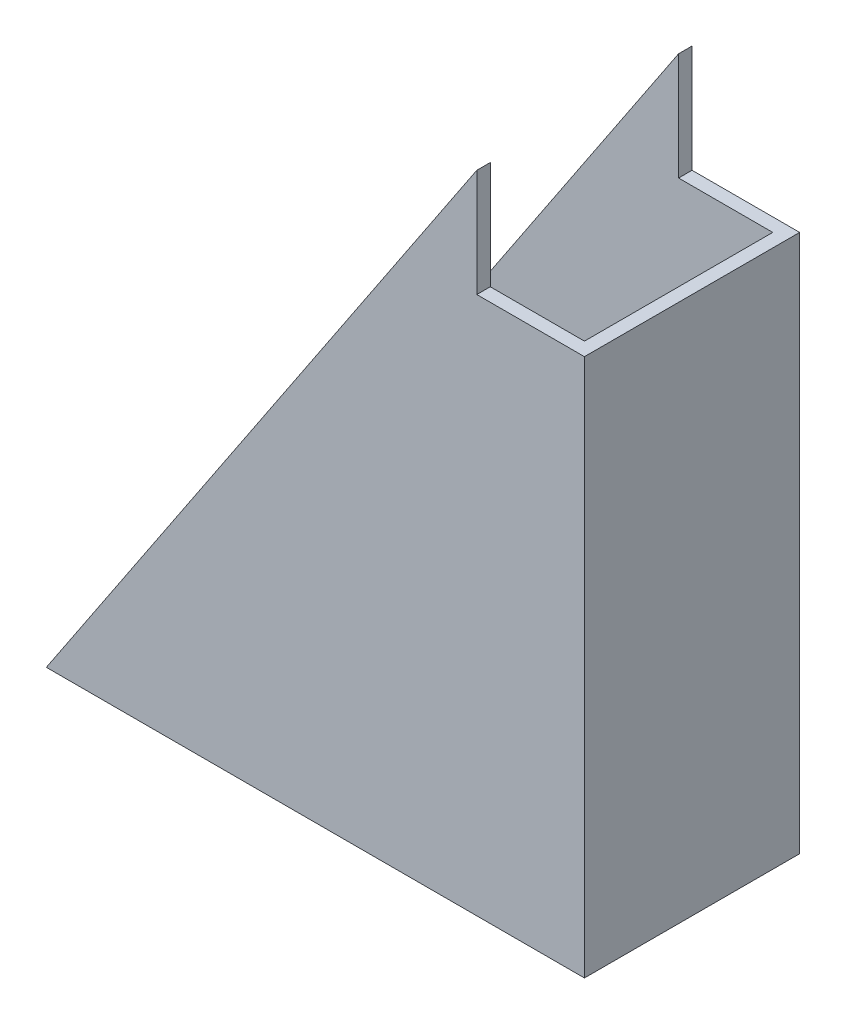
ISO-10303-21;
HEADER;
FILE_DESCRIPTION(('STEP AP214'),'2;1');
FILE_NAME('part.step','',(''),(''),'','','');
FILE_SCHEMA(('AUTOMOTIVE_DESIGN { 1 0 10303 214 1 1 1 1 }'));
ENDSEC;
DATA;
#1=APPLICATION_CONTEXT('core data for automotive mechanical design processes');
#2=APPLICATION_PROTOCOL_DEFINITION('international standard','automotive_design',2000,#1);
#3=PRODUCT_CONTEXT('',#1,'mechanical');
#4=PRODUCT('Part','Part','',(#3));
#5=PRODUCT_RELATED_PRODUCT_CATEGORY('part','',(#4));
#6=PRODUCT_DEFINITION_FORMATION('','',#4);
#7=PRODUCT_DEFINITION_CONTEXT('part definition',#1,'design');
#8=PRODUCT_DEFINITION('design','',#6,#7);
#9=PRODUCT_DEFINITION_SHAPE('','',#8);
#10=(LENGTH_UNIT() NAMED_UNIT(*) SI_UNIT(.MILLI.,.METRE.));
#11=(NAMED_UNIT(*) PLANE_ANGLE_UNIT() SI_UNIT($,.RADIAN.));
#12=(NAMED_UNIT(*) SI_UNIT($,.STERADIAN.) SOLID_ANGLE_UNIT());
#13=UNCERTAINTY_MEASURE_WITH_UNIT(LENGTH_MEASURE(1.E-05),#10,'distance_accuracy_value','');
#14=(GEOMETRIC_REPRESENTATION_CONTEXT(3) GLOBAL_UNCERTAINTY_ASSIGNED_CONTEXT((#13)) GLOBAL_UNIT_ASSIGNED_CONTEXT((#10,
#11,#12)) REPRESENTATION_CONTEXT('',''));
#15=CARTESIAN_POINT('',(0.,0.,0.));
#16=DIRECTION('',(0.,0.,1.));
#17=DIRECTION('',(1.,0.,0.));
#18=AXIS2_PLACEMENT_3D('',#15,#16,#17);
#19=CARTESIAN_POINT('',(266.7,101.6,381.));
#20=DIRECTION('',(0.,0.,-1.));
#21=DIRECTION('',(0.,1.,0.));
#22=AXIS2_PLACEMENT_3D('',#19,#20,#21);
#23=PLANE('',#22);
#24=DIRECTION('',(0.,-1.,0.));
#25=VECTOR('',#24,1.);
#26=CARTESIAN_POINT('',(317.499999999999,-1.38777878078144E-12,381.));
#27=LINE('',#26,#25);
#28=CARTESIAN_POINT('',(317.5,101.6,381.));
#29=VERTEX_POINT('',#28);
#30=CARTESIAN_POINT('',(317.5,88.8999999999999,381.));
#31=VERTEX_POINT('',#30);
#32=EDGE_CURVE('E121',#29,#31,#27,.T.);
#33=ORIENTED_EDGE('',*,*,#32,.F.);
#34=DIRECTION('',(-0.554700196225229,-0.832050294337844,0.));
#35=VECTOR('',#34,1.);
#36=CARTESIAN_POINT('',(172.915384615385,-115.276923076923,381.));
#37=LINE('',#36,#35);
#38=CARTESIAN_POINT('',(266.7,25.4,381.));
#39=VERTEX_POINT('',#38);
#40=EDGE_CURVE('E133',#29,#39,#37,.T.);
#41=ORIENTED_EDGE('',*,*,#40,.T.);
#42=DIRECTION('',(1.,0.,0.));
#43=VECTOR('',#42,1.);
#44=CARTESIAN_POINT('',(266.7,25.4,381.));
#45=LINE('',#44,#43);
#46=CARTESIAN_POINT('',(330.2,25.4,381.));
#47=VERTEX_POINT('',#46);
#48=EDGE_CURVE('E175',#39,#47,#45,.T.);
#49=ORIENTED_EDGE('',*,*,#48,.T.);
#50=DIRECTION('',(0.,-1.,0.));
#51=VECTOR('',#50,1.);
#52=CARTESIAN_POINT('',(330.2,101.6,381.));
#53=LINE('',#52,#51);
#54=CARTESIAN_POINT('',(330.2,88.9,381.));
#55=VERTEX_POINT('',#54);
#56=EDGE_CURVE('E185',#55,#47,#53,.T.);
#57=ORIENTED_EDGE('',*,*,#56,.F.);
#58=DIRECTION('',(-1.,0.,0.));
#59=VECTOR('',#58,1.);
#60=CARTESIAN_POINT('',(-4.85722573273492E-13,88.8999999999982,381.));
#61=LINE('',#60,#59);
#62=EDGE_CURVE('E136',#55,#31,#61,.T.);
#63=ORIENTED_EDGE('',*,*,#62,.T.);
#64=EDGE_LOOP('',(#33,#41,#49,#57,#63));
#65=FACE_BOUND('',#64,.T.);
#66=ADVANCED_FACE('F35',(#65),#23,.F.);
#67=CARTESIAN_POINT('',(266.7,101.6,355.6));
#68=DIRECTION('',(0.,0.,1.));
#69=DIRECTION('',(0.,-1.,0.));
#70=AXIS2_PLACEMENT_3D('',#67,#68,#69);
#71=PLANE('',#70);
#72=DIRECTION('',(0.,1.,0.));
#73=VECTOR('',#72,1.);
#74=CARTESIAN_POINT('',(317.5,101.6,355.6));
#75=LINE('',#74,#73);
#76=CARTESIAN_POINT('',(317.5,88.8999999999999,355.6));
#77=VERTEX_POINT('',#76);
#78=CARTESIAN_POINT('',(317.5,101.6,355.6));
#79=VERTEX_POINT('',#78);
#80=EDGE_CURVE('E205',#77,#79,#75,.T.);
#81=ORIENTED_EDGE('',*,*,#80,.F.);
#82=DIRECTION('',(1.,0.,0.));
#83=VECTOR('',#82,1.);
#84=CARTESIAN_POINT('',(266.7,88.8999999999997,355.6));
#85=LINE('',#84,#83);
#86=CARTESIAN_POINT('',(330.2,88.9,355.6));
#87=VERTEX_POINT('',#86);
#88=EDGE_CURVE('E141',#77,#87,#85,.T.);
#89=ORIENTED_EDGE('',*,*,#88,.T.);
#90=DIRECTION('',(0.,-1.,0.));
#91=VECTOR('',#90,1.);
#92=CARTESIAN_POINT('',(330.2,101.6,355.6));
#93=LINE('',#92,#91);
#94=CARTESIAN_POINT('',(330.2,25.4,355.6));
#95=VERTEX_POINT('',#94);
#96=EDGE_CURVE('E183',#87,#95,#93,.T.);
#97=ORIENTED_EDGE('',*,*,#96,.T.);
#98=DIRECTION('',(-1.,0.,0.));
#99=VECTOR('',#98,1.);
#100=CARTESIAN_POINT('',(266.7,25.4,355.6));
#101=LINE('',#100,#99);
#102=CARTESIAN_POINT('',(266.7,25.4,355.6));
#103=VERTEX_POINT('',#102);
#104=EDGE_CURVE('E180',#95,#103,#101,.T.);
#105=ORIENTED_EDGE('',*,*,#104,.T.);
#106=DIRECTION('',(0.554700196225229,0.832050294337844,0.));
#107=VECTOR('',#106,1.);
#108=CARTESIAN_POINT('',(301.869230769231,78.1538461538461,355.6));
#109=LINE('',#108,#107);
#110=EDGE_CURVE('E152',#103,#79,#109,.T.);
#111=ORIENTED_EDGE('',*,*,#110,.T.);
#112=EDGE_LOOP('',(#81,#89,#97,#105,#111));
#113=FACE_BOUND('',#112,.T.);
#114=ADVANCED_FACE('F223',(#113),#71,.F.);
#115=CARTESIAN_POINT('',(268.2875,101.6,379.4125));
#116=DIRECTION('',(0.,0.,-1.));
#117=DIRECTION('',(0.,1.,0.));
#118=AXIS2_PLACEMENT_3D('',#115,#116,#117);
#119=PLANE('',#118);
#120=DIRECTION('',(-0.554700196225229,-0.832050294337844,0.));
#121=VECTOR('',#120,1.);
#122=CARTESIAN_POINT('',(302.357692307692,78.8865384615384,379.4125));
#123=LINE('',#122,#121);
#124=CARTESIAN_POINT('',(317.5,101.6,379.4125));
#125=VERTEX_POINT('',#124);
#126=CARTESIAN_POINT('',(268.2875,27.7812500000001,379.4125));
#127=VERTEX_POINT('',#126);
#128=EDGE_CURVE('E150',#125,#127,#123,.T.);
#129=ORIENTED_EDGE('',*,*,#128,.F.);
#130=DIRECTION('',(0.,-1.,0.));
#131=VECTOR('',#130,1.);
#132=CARTESIAN_POINT('',(317.5,101.6,379.4125));
#133=LINE('',#132,#131);
#134=CARTESIAN_POINT('',(317.5,88.8999999999999,379.4125));
#135=VERTEX_POINT('',#134);
#136=EDGE_CURVE('E124',#125,#135,#133,.T.);
#137=ORIENTED_EDGE('',*,*,#136,.T.);
#138=DIRECTION('',(-1.,0.,0.));
#139=VECTOR('',#138,1.);
#140=CARTESIAN_POINT('',(268.2875,88.8999999999997,379.4125));
#141=LINE('',#140,#139);
#142=CARTESIAN_POINT('',(328.6125,88.9,379.4125));
#143=VERTEX_POINT('',#142);
#144=EDGE_CURVE('E145',#143,#135,#141,.T.);
#145=ORIENTED_EDGE('',*,*,#144,.F.);
#146=DIRECTION('',(0.,-1.,0.));
#147=VECTOR('',#146,1.);
#148=CARTESIAN_POINT('',(328.6125,101.6,379.4125));
#149=LINE('',#148,#147);
#150=CARTESIAN_POINT('',(328.6125,25.4,379.4125));
#151=VERTEX_POINT('',#150);
#152=EDGE_CURVE('E170',#143,#151,#149,.T.);
#153=ORIENTED_EDGE('',*,*,#152,.T.);
#154=DIRECTION('',(1.,0.,0.));
#155=VECTOR('',#154,1.);
#156=CARTESIAN_POINT('',(268.2875,25.4,379.4125));
#157=LINE('',#156,#155);
#158=CARTESIAN_POINT('',(268.2875,25.4,379.4125));
#159=VERTEX_POINT('',#158);
#160=EDGE_CURVE('E158',#159,#151,#157,.T.);
#161=ORIENTED_EDGE('',*,*,#160,.F.);
#162=DIRECTION('',(0.,-1.,0.));
#163=VECTOR('',#162,1.);
#164=CARTESIAN_POINT('',(268.2875,101.6,379.4125));
#165=LINE('',#164,#163);
#166=EDGE_CURVE('E172',#127,#159,#165,.T.);
#167=ORIENTED_EDGE('',*,*,#166,.F.);
#168=EDGE_LOOP('',(#129,#137,#145,#153,#161,#167));
#169=FACE_BOUND('',#168,.T.);
#170=ADVANCED_FACE('F242',(#169),#119,.T.);
#171=CARTESIAN_POINT('',(268.2875,101.6,357.1875));
#172=DIRECTION('',(0.,0.,1.));
#173=DIRECTION('',(0.,-1.,0.));
#174=AXIS2_PLACEMENT_3D('',#171,#172,#173);
#175=PLANE('',#174);
#176=DIRECTION('',(1.,0.,0.));
#177=VECTOR('',#176,1.);
#178=CARTESIAN_POINT('',(268.2875,88.8999999999997,357.1875));
#179=LINE('',#178,#177);
#180=CARTESIAN_POINT('',(317.5,88.8999999999999,357.1875));
#181=VERTEX_POINT('',#180);
#182=CARTESIAN_POINT('',(328.6125,88.9,357.1875));
#183=VERTEX_POINT('',#182);
#184=EDGE_CURVE('E11',#181,#183,#179,.T.);
#185=ORIENTED_EDGE('',*,*,#184,.F.);
#186=DIRECTION('',(0.,1.,0.));
#187=VECTOR('',#186,1.);
#188=CARTESIAN_POINT('',(317.5,101.6,357.1875));
#189=LINE('',#188,#187);
#190=CARTESIAN_POINT('',(317.5,101.6,357.1875));
#191=VERTEX_POINT('',#190);
#192=EDGE_CURVE('E189',#181,#191,#189,.T.);
#193=ORIENTED_EDGE('',*,*,#192,.T.);
#194=DIRECTION('',(0.554700196225229,0.832050294337844,0.));
#195=VECTOR('',#194,1.);
#196=CARTESIAN_POINT('',(302.357692307692,78.8865384615384,357.1875));
#197=LINE('',#196,#195);
#198=CARTESIAN_POINT('',(268.2875,27.7812500000001,357.1875));
#199=VERTEX_POINT('',#198);
#200=EDGE_CURVE('E42',#199,#191,#197,.T.);
#201=ORIENTED_EDGE('',*,*,#200,.F.);
#202=DIRECTION('',(0.,-1.,0.));
#203=VECTOR('',#202,1.);
#204=CARTESIAN_POINT('',(268.2875,101.6,357.1875));
#205=LINE('',#204,#203);
#206=CARTESIAN_POINT('',(268.2875,25.4,357.1875));
#207=VERTEX_POINT('',#206);
#208=EDGE_CURVE('E56',#199,#207,#205,.T.);
#209=ORIENTED_EDGE('',*,*,#208,.T.);
#210=DIRECTION('',(-1.,0.,0.));
#211=VECTOR('',#210,1.);
#212=CARTESIAN_POINT('',(268.2875,25.4,357.1875));
#213=LINE('',#212,#211);
#214=CARTESIAN_POINT('',(328.6125,25.4,357.1875));
#215=VERTEX_POINT('',#214);
#216=EDGE_CURVE('E164',#215,#207,#213,.T.);
#217=ORIENTED_EDGE('',*,*,#216,.F.);
#218=DIRECTION('',(0.,-1.,0.));
#219=VECTOR('',#218,1.);
#220=CARTESIAN_POINT('',(328.6125,101.6,357.1875));
#221=LINE('',#220,#219);
#222=EDGE_CURVE('E168',#183,#215,#221,.T.);
#223=ORIENTED_EDGE('',*,*,#222,.F.);
#224=EDGE_LOOP('',(#185,#193,#201,#209,#217,#223));
#225=FACE_BOUND('',#224,.T.);
#226=ADVANCED_FACE('F188',(#225),#175,.T.);
#227=CARTESIAN_POINT('',(0.,25.4,0.));
#228=DIRECTION('',(0.,-1.,0.));
#229=DIRECTION('',(0.,0.,-1.));
#230=AXIS2_PLACEMENT_3D('',#227,#228,#229);
#231=PLANE('',#230);
#232=DIRECTION('',(0.,0.,1.));
#233=VECTOR('',#232,1.);
#234=CARTESIAN_POINT('',(266.7,25.4,381.));
#235=LINE('',#234,#233);
#236=EDGE_CURVE('E140',#103,#39,#235,.T.);
#237=ORIENTED_EDGE('',*,*,#236,.F.);
#238=ORIENTED_EDGE('',*,*,#104,.F.);
#239=DIRECTION('',(0.,0.,-1.));
#240=VECTOR('',#239,1.);
#241=CARTESIAN_POINT('',(330.2,25.4,381.));
#242=LINE('',#241,#240);
#243=EDGE_CURVE('E177',#47,#95,#242,.T.);
#244=ORIENTED_EDGE('',*,*,#243,.F.);
#245=ORIENTED_EDGE('',*,*,#48,.F.);
#246=EDGE_LOOP('',(#237,#238,#244,#245));
#247=FACE_BOUND('',#246,.T.);
#248=ORIENTED_EDGE('',*,*,#216,.T.);
#249=DIRECTION('',(0.,0.,1.));
#250=VECTOR('',#249,1.);
#251=CARTESIAN_POINT('',(268.2875,25.4,379.4125));
#252=LINE('',#251,#250);
#253=EDGE_CURVE('E155',#207,#159,#252,.T.);
#254=ORIENTED_EDGE('',*,*,#253,.T.);
#255=ORIENTED_EDGE('',*,*,#160,.T.);
#256=DIRECTION('',(0.,0.,-1.));
#257=VECTOR('',#256,1.);
#258=CARTESIAN_POINT('',(328.6125,25.4,379.4125));
#259=LINE('',#258,#257);
#260=EDGE_CURVE('E161',#151,#215,#259,.T.);
#261=ORIENTED_EDGE('',*,*,#260,.T.);
#262=EDGE_LOOP('',(#248,#254,#255,#261));
#263=FACE_BOUND('',#262,.T.);
#264=ADVANCED_FACE('F195',(#247,#263),#231,.T.);
#265=CARTESIAN_POINT('',(330.2,101.6,381.));
#266=DIRECTION('',(-1.,0.,0.));
#267=DIRECTION('',(0.,0.,1.));
#268=AXIS2_PLACEMENT_3D('',#265,#266,#267);
#269=PLANE('',#268);
#270=ORIENTED_EDGE('',*,*,#96,.F.);
#271=DIRECTION('',(0.,0.,-1.));
#272=VECTOR('',#271,1.);
#273=CARTESIAN_POINT('',(330.2,88.9,381.));
#274=LINE('',#273,#272);
#275=EDGE_CURVE('E214',#55,#87,#274,.T.);
#276=ORIENTED_EDGE('',*,*,#275,.F.);
#277=ORIENTED_EDGE('',*,*,#56,.T.);
#278=ORIENTED_EDGE('',*,*,#243,.T.);
#279=EDGE_LOOP('',(#270,#276,#277,#278));
#280=FACE_BOUND('',#279,.T.);
#281=ADVANCED_FACE('F229',(#280),#269,.F.);
#282=CARTESIAN_POINT('',(268.2875,101.6,379.4125));
#283=DIRECTION('',(1.,0.,0.));
#284=DIRECTION('',(0.,0.,-1.));
#285=AXIS2_PLACEMENT_3D('',#282,#283,#284);
#286=PLANE('',#285);
#287=DIRECTION('',(0.,0.,-1.));
#288=VECTOR('',#287,1.);
#289=CARTESIAN_POINT('',(268.2875,27.7812500000001,379.4125));
#290=LINE('',#289,#288);
#291=EDGE_CURVE('E49',#127,#199,#290,.T.);
#292=ORIENTED_EDGE('',*,*,#291,.F.);
#293=ORIENTED_EDGE('',*,*,#166,.T.);
#294=ORIENTED_EDGE('',*,*,#253,.F.);
#295=ORIENTED_EDGE('',*,*,#208,.F.);
#296=EDGE_LOOP('',(#292,#293,#294,#295));
#297=FACE_BOUND('',#296,.T.);
#298=ADVANCED_FACE('F191',(#297),#286,.T.);
#299=CARTESIAN_POINT('',(328.6125,101.6,379.4125));
#300=DIRECTION('',(-1.,0.,0.));
#301=DIRECTION('',(0.,0.,1.));
#302=AXIS2_PLACEMENT_3D('',#299,#300,#301);
#303=PLANE('',#302);
#304=DIRECTION('',(0.,0.,1.));
#305=VECTOR('',#304,1.);
#306=CARTESIAN_POINT('',(328.6125,88.9,379.4125));
#307=LINE('',#306,#305);
#308=EDGE_CURVE('E202',#183,#143,#307,.T.);
#309=ORIENTED_EDGE('',*,*,#308,.F.);
#310=ORIENTED_EDGE('',*,*,#222,.T.);
#311=ORIENTED_EDGE('',*,*,#260,.F.);
#312=ORIENTED_EDGE('',*,*,#152,.F.);
#313=EDGE_LOOP('',(#309,#310,#311,#312));
#314=FACE_BOUND('',#313,.T.);
#315=ADVANCED_FACE('F200',(#314),#303,.T.);
#316=CARTESIAN_POINT('',(172.915384615385,-115.276923076923,381.));
#317=DIRECTION('',(0.832050294337844,-0.554700196225229,0.));
#318=DIRECTION('',(0.554700196225229,0.832050294337844,0.));
#319=AXIS2_PLACEMENT_3D('',#316,#317,#318);
#320=PLANE('',#319);
#321=ORIENTED_EDGE('',*,*,#236,.T.);
#322=ORIENTED_EDGE('',*,*,#40,.F.);
#323=DIRECTION('',(0.,0.,-1.));
#324=VECTOR('',#323,1.);
#325=CARTESIAN_POINT('',(317.5,101.6,381.));
#326=LINE('',#325,#324);
#327=EDGE_CURVE('E117',#29,#125,#326,.T.);
#328=ORIENTED_EDGE('',*,*,#327,.T.);
#329=ORIENTED_EDGE('',*,*,#128,.T.);
#330=ORIENTED_EDGE('',*,*,#291,.T.);
#331=ORIENTED_EDGE('',*,*,#200,.T.);
#332=EDGE_CURVE('E127',#191,#79,#326,.T.);
#333=ORIENTED_EDGE('',*,*,#332,.T.);
#334=ORIENTED_EDGE('',*,*,#110,.F.);
#335=EDGE_LOOP('',(#321,#322,#328,#329,#330,#331,#333,#334));
#336=FACE_BOUND('',#335,.T.);
#337=ADVANCED_FACE('F138',(#336),#320,.F.);
#338=CARTESIAN_POINT('',(-4.85722573273492E-13,88.8999999999982,381.));
#339=DIRECTION('',(0.,-1.,0.));
#340=DIRECTION('',(1.,0.,0.));
#341=AXIS2_PLACEMENT_3D('',#338,#339,#340);
#342=PLANE('',#341);
#343=DIRECTION('',(0.,0.,-1.));
#344=VECTOR('',#343,1.);
#345=CARTESIAN_POINT('',(317.5,88.8999999999999,381.));
#346=LINE('',#345,#344);
#347=EDGE_CURVE('E213',#181,#77,#346,.T.);
#348=ORIENTED_EDGE('',*,*,#347,.F.);
#349=ORIENTED_EDGE('',*,*,#184,.T.);
#350=ORIENTED_EDGE('',*,*,#308,.T.);
#351=ORIENTED_EDGE('',*,*,#144,.T.);
#352=EDGE_CURVE('E211',#31,#135,#346,.T.);
#353=ORIENTED_EDGE('',*,*,#352,.F.);
#354=ORIENTED_EDGE('',*,*,#62,.F.);
#355=ORIENTED_EDGE('',*,*,#275,.T.);
#356=ORIENTED_EDGE('',*,*,#88,.F.);
#357=EDGE_LOOP('',(#348,#349,#350,#351,#353,#354,#355,#356));
#358=FACE_BOUND('',#357,.T.);
#359=ADVANCED_FACE('F255',(#358),#342,.F.);
#360=CARTESIAN_POINT('',(317.499999999999,-1.38777878078144E-12,381.));
#361=DIRECTION('',(1.,0.,0.));
#362=DIRECTION('',(0.,1.,0.));
#363=AXIS2_PLACEMENT_3D('',#360,#361,#362);
#364=PLANE('',#363);
#365=ORIENTED_EDGE('',*,*,#80,.T.);
#366=ORIENTED_EDGE('',*,*,#332,.F.);
#367=ORIENTED_EDGE('',*,*,#192,.F.);
#368=ORIENTED_EDGE('',*,*,#347,.T.);
#369=EDGE_LOOP('',(#365,#366,#367,#368));
#370=FACE_BOUND('',#369,.T.);
#371=ADVANCED_FACE('F221',(#370),#364,.T.);
#372=ORIENTED_EDGE('',*,*,#327,.F.);
#373=ORIENTED_EDGE('',*,*,#32,.T.);
#374=ORIENTED_EDGE('',*,*,#352,.T.);
#375=ORIENTED_EDGE('',*,*,#136,.F.);
#376=EDGE_LOOP('',(#372,#373,#374,#375));
#377=FACE_BOUND('',#376,.T.);
#378=ADVANCED_FACE('F119',(#377),#364,.T.);
#379=CLOSED_SHELL('',(#66,#114,#170,#226,#264,#281,#298,#315,#337,#359,#371,#378));
#380=MANIFOLD_SOLID_BREP('B2',#379);
#381=ADVANCED_BREP_SHAPE_REPRESENTATION('',(#18,#380),#14);
#382=SHAPE_DEFINITION_REPRESENTATION(#9,#381);
ENDSEC;
END-ISO-10303-21;
